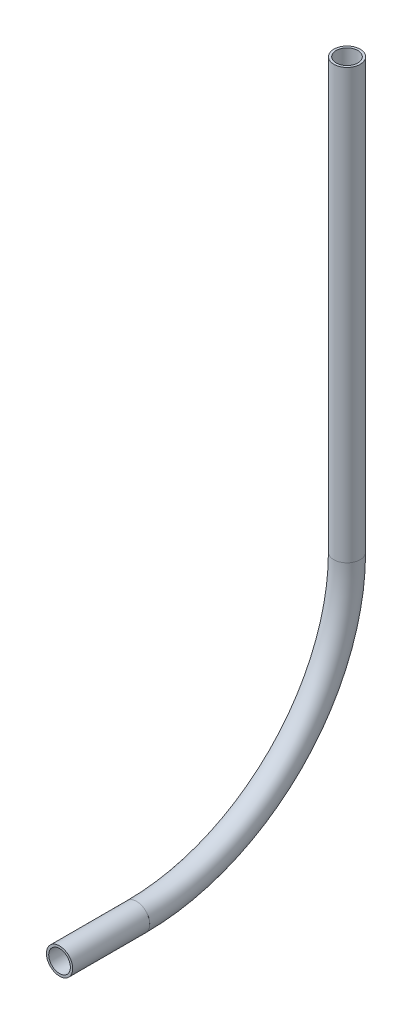
ISO-10303-21;
HEADER;
FILE_DESCRIPTION(('STEP AP214'),'2;1');
FILE_NAME('part.step','',(''),(''),'','','');
FILE_SCHEMA(('AUTOMOTIVE_DESIGN { 1 0 10303 214 1 1 1 1 }'));
ENDSEC;
DATA;
#1=APPLICATION_CONTEXT('core data for automotive mechanical design processes');
#2=APPLICATION_PROTOCOL_DEFINITION('international standard','automotive_design',2000,#1);
#3=PRODUCT_CONTEXT('',#1,'mechanical');
#4=PRODUCT('Part','Part','',(#3));
#5=PRODUCT_RELATED_PRODUCT_CATEGORY('part','',(#4));
#6=PRODUCT_DEFINITION_FORMATION('','',#4);
#7=PRODUCT_DEFINITION_CONTEXT('part definition',#1,'design');
#8=PRODUCT_DEFINITION('design','',#6,#7);
#9=PRODUCT_DEFINITION_SHAPE('','',#8);
#10=(LENGTH_UNIT() NAMED_UNIT(*) SI_UNIT(.MILLI.,.METRE.));
#11=(NAMED_UNIT(*) PLANE_ANGLE_UNIT() SI_UNIT($,.RADIAN.));
#12=(NAMED_UNIT(*) SI_UNIT($,.STERADIAN.) SOLID_ANGLE_UNIT());
#13=UNCERTAINTY_MEASURE_WITH_UNIT(LENGTH_MEASURE(1.E-05),#10,'distance_accuracy_value','');
#14=(GEOMETRIC_REPRESENTATION_CONTEXT(3) GLOBAL_UNCERTAINTY_ASSIGNED_CONTEXT((#13)) GLOBAL_UNIT_ASSIGNED_CONTEXT((#10,
#11,#12)) REPRESENTATION_CONTEXT('',''));
#15=CARTESIAN_POINT('',(0.,0.,0.));
#16=DIRECTION('',(0.,0.,1.));
#17=DIRECTION('',(1.,0.,0.));
#18=AXIS2_PLACEMENT_3D('',#15,#16,#17);
#19=CARTESIAN_POINT('',(0.,598.064549316462,284.557390711818));
#20=DIRECTION('',(0.,0.,1.));
#21=DIRECTION('',(1.,0.,0.));
#22=AXIS2_PLACEMENT_3D('',#19,#20,#21);
#23=CYLINDRICAL_SURFACE('',#22,2.61620000000002);
#24=CARTESIAN_POINT('',(0.,598.064549316462,303.16459571102));
#25=DIRECTION('',(0.,0.,-1.));
#26=DIRECTION('',(-1.,0.,0.));
#27=AXIS2_PLACEMENT_3D('',#24,#25,#26);
#28=CIRCLE('',#27,2.61620000000002);
#29=CARTESIAN_POINT('',(-2.61620000000002,598.064549316462,303.16459571102));
#30=VERTEX_POINT('',#29);
#31=EDGE_CURVE('E55',#30,#30,#28,.T.);
#32=ORIENTED_EDGE('',*,*,#31,.F.);
#33=EDGE_LOOP('',(#32));
#34=FACE_BOUND('',#33,.T.);
#35=CARTESIAN_POINT('',(0.,598.064549316462,284.557390711818));
#36=DIRECTION('',(0.,0.,-1.));
#37=DIRECTION('',(-1.,0.,0.));
#38=AXIS2_PLACEMENT_3D('',#35,#36,#37);
#39=CIRCLE('',#38,2.61620000000002);
#40=CARTESIAN_POINT('',(-2.61620000000002,598.064549316462,284.557390711818));
#41=VERTEX_POINT('',#40);
#42=EDGE_CURVE('E51',#41,#41,#39,.T.);
#43=ORIENTED_EDGE('',*,*,#42,.T.);
#44=EDGE_LOOP('',(#43));
#45=FACE_BOUND('',#44,.T.);
#46=ADVANCED_FACE('F47',(#34,#45),#23,.F.);
#47=CARTESIAN_POINT('',(0.,598.064549316462,284.557390711818));
#48=DIRECTION('',(0.,0.,1.));
#49=DIRECTION('',(1.,0.,0.));
#50=AXIS2_PLACEMENT_3D('',#47,#48,#49);
#51=CYLINDRICAL_SURFACE('',#50,3.17499999999997);
#52=CARTESIAN_POINT('',(0.,598.064549316462,303.16459571102));
#53=DIRECTION('',(0.,0.,-1.));
#54=DIRECTION('',(-1.,0.,0.));
#55=AXIS2_PLACEMENT_3D('',#52,#53,#54);
#56=CIRCLE('',#55,3.17499999999997);
#57=CARTESIAN_POINT('',(-3.17499999999997,598.064549316462,303.16459571102));
#58=VERTEX_POINT('',#57);
#59=EDGE_CURVE('E59',#58,#58,#56,.T.);
#60=ORIENTED_EDGE('',*,*,#59,.T.);
#61=EDGE_LOOP('',(#60));
#62=FACE_BOUND('',#61,.T.);
#63=CARTESIAN_POINT('',(0.,598.064549316462,284.557390711818));
#64=DIRECTION('',(0.,0.,-1.));
#65=DIRECTION('',(-1.,0.,0.));
#66=AXIS2_PLACEMENT_3D('',#63,#64,#65);
#67=CIRCLE('',#66,3.17499999999997);
#68=CARTESIAN_POINT('',(-3.17499999999997,598.064549316462,284.557390711818));
#69=VERTEX_POINT('',#68);
#70=EDGE_CURVE('E12',#69,#69,#67,.T.);
#71=ORIENTED_EDGE('',*,*,#70,.F.);
#72=EDGE_LOOP('',(#71));
#73=FACE_BOUND('',#72,.T.);
#74=ADVANCED_FACE('F74',(#62,#73),#51,.T.);
#75=CARTESIAN_POINT('',(0.,598.064549316462,303.16459571102));
#76=DIRECTION('',(0.,0.,-1.));
#77=DIRECTION('',(-1.,0.,0.));
#78=AXIS2_PLACEMENT_3D('',#75,#76,#77);
#79=PLANE('',#78);
#80=ORIENTED_EDGE('',*,*,#31,.T.);
#81=EDGE_LOOP('',(#80));
#82=FACE_BOUND('',#81,.T.);
#83=ORIENTED_EDGE('',*,*,#59,.F.);
#84=EDGE_LOOP('',(#83));
#85=FACE_BOUND('',#84,.T.);
#86=ADVANCED_FACE('F70',(#82,#85),#79,.F.);
#87=CARTESIAN_POINT('',(0.,598.064549316462,284.557390711818));
#88=DIRECTION('',(0.,0.,-1.));
#89=DIRECTION('',(-1.,0.,0.));
#90=AXIS2_PLACEMENT_3D('',#87,#88,#89);
#91=PLANE('',#90);
#92=ORIENTED_EDGE('',*,*,#42,.F.);
#93=EDGE_LOOP('',(#92));
#94=FACE_BOUND('',#93,.T.);
#95=ORIENTED_EDGE('',*,*,#70,.T.);
#96=EDGE_LOOP('',(#95));
#97=FACE_BOUND('',#96,.T.);
#98=ADVANCED_FACE('F49',(#94,#97),#91,.T.);
#99=CLOSED_SHELL('',(#46,#74,#86,#98));
#100=MANIFOLD_SOLID_BREP('B2',#99);
#101=CARTESIAN_POINT('',(0.,648.864549316462,284.557390711818));
#102=DIRECTION('',(-1.,0.,0.));
#103=DIRECTION('',(0.,0.,1.));
#104=AXIS2_PLACEMENT_3D('',#101,#102,#103);
#105=TOROIDAL_SURFACE('',#104,50.8,2.61620000000002);
#106=CARTESIAN_POINT('',(0.,648.864549316462,233.757390711818));
#107=DIRECTION('',(0.,1.,0.));
#108=DIRECTION('',(0.,0.,1.));
#109=AXIS2_PLACEMENT_3D('',#106,#107,#108);
#110=CIRCLE('',#109,2.61620000000002);
#111=CARTESIAN_POINT('',(0.,648.864549316462,231.141190711818));
#112=VERTEX_POINT('',#111);
#113=EDGE_CURVE('E150',#112,#112,#110,.T.);
#114=CARTESIAN_POINT('',(0.,598.064549316462,284.557390711818));
#115=DIRECTION('',(0.,0.,1.));
#116=DIRECTION('',(1.,0.,0.));
#117=AXIS2_PLACEMENT_3D('',#114,#115,#116);
#118=CIRCLE('',#117,2.61620000000002);
#119=CARTESIAN_POINT('',(0.,595.448349316462,284.557390711818));
#120=VERTEX_POINT('',#119);
#121=EDGE_CURVE('E140',#120,#120,#118,.T.);
#122=CARTESIAN_POINT('',(0.,648.864549316462,284.557390711818));
#123=DIRECTION('',(-1.,0.,0.));
#124=DIRECTION('',(0.,0.,1.));
#125=AXIS2_PLACEMENT_3D('',#122,#123,#124);
#126=CIRCLE('',#125,53.4162);
#127=EDGE_CURVE('',#112,#120,#126,.T.);
#128=ORIENTED_EDGE('',*,*,#113,.T.);
#129=ORIENTED_EDGE('',*,*,#121,.T.);
#130=ORIENTED_EDGE('',*,*,#127,.T.);
#131=ORIENTED_EDGE('',*,*,#127,.F.);
#132=EDGE_LOOP('',(#128,#130,#129,#131));
#133=FACE_BOUND('',#132,.T.);
#134=ADVANCED_FACE('F136',(#133),#105,.F.);
#135=CARTESIAN_POINT('',(0.,648.864549316462,284.557390711818));
#136=DIRECTION('',(-1.,0.,0.));
#137=DIRECTION('',(0.,0.,1.));
#138=AXIS2_PLACEMENT_3D('',#135,#136,#137);
#139=TOROIDAL_SURFACE('',#138,50.8,3.17499999999997);
#140=CARTESIAN_POINT('',(0.,648.864549316462,233.757390711818));
#141=DIRECTION('',(0.,1.,0.));
#142=DIRECTION('',(0.,0.,1.));
#143=AXIS2_PLACEMENT_3D('',#140,#141,#142);
#144=CIRCLE('',#143,3.17499999999997);
#145=CARTESIAN_POINT('',(0.,648.864549316462,230.582390711818));
#146=VERTEX_POINT('',#145);
#147=EDGE_CURVE('E144',#146,#146,#144,.T.);
#148=CARTESIAN_POINT('',(0.,598.064549316462,284.557390711818));
#149=DIRECTION('',(0.,0.,1.));
#150=DIRECTION('',(1.,0.,0.));
#151=AXIS2_PLACEMENT_3D('',#148,#149,#150);
#152=CIRCLE('',#151,3.17499999999997);
#153=CARTESIAN_POINT('',(0.,594.889549316462,284.557390711818));
#154=VERTEX_POINT('',#153);
#155=EDGE_CURVE('E46',#154,#154,#152,.T.);
#156=CARTESIAN_POINT('',(0.,648.864549316462,284.557390711818));
#157=DIRECTION('',(-1.,0.,0.));
#158=DIRECTION('',(0.,0.,1.));
#159=AXIS2_PLACEMENT_3D('',#156,#157,#158);
#160=CIRCLE('',#159,53.975);
#161=EDGE_CURVE('',#146,#154,#160,.T.);
#162=ORIENTED_EDGE('',*,*,#147,.F.);
#163=ORIENTED_EDGE('',*,*,#155,.F.);
#164=ORIENTED_EDGE('',*,*,#161,.T.);
#165=ORIENTED_EDGE('',*,*,#161,.F.);
#166=EDGE_LOOP('',(#162,#164,#163,#165));
#167=FACE_BOUND('',#166,.T.);
#168=ADVANCED_FACE('F163',(#167),#139,.T.);
#169=CARTESIAN_POINT('',(0.,648.864549316462,233.757390711818));
#170=DIRECTION('',(0.,1.,0.));
#171=DIRECTION('',(0.,0.,1.));
#172=AXIS2_PLACEMENT_3D('',#169,#170,#171);
#173=PLANE('',#172);
#174=ORIENTED_EDGE('',*,*,#113,.F.);
#175=EDGE_LOOP('',(#174));
#176=FACE_BOUND('',#175,.T.);
#177=ORIENTED_EDGE('',*,*,#147,.T.);
#178=EDGE_LOOP('',(#177));
#179=FACE_BOUND('',#178,.T.);
#180=ADVANCED_FACE('F159',(#176,#179),#173,.T.);
#181=CARTESIAN_POINT('',(0.,598.064549316462,284.557390711818));
#182=DIRECTION('',(0.,0.,1.));
#183=DIRECTION('',(1.,0.,0.));
#184=AXIS2_PLACEMENT_3D('',#181,#182,#183);
#185=PLANE('',#184);
#186=ORIENTED_EDGE('',*,*,#121,.F.);
#187=EDGE_LOOP('',(#186));
#188=FACE_BOUND('',#187,.T.);
#189=ORIENTED_EDGE('',*,*,#155,.T.);
#190=EDGE_LOOP('',(#189));
#191=FACE_BOUND('',#190,.T.);
#192=ADVANCED_FACE('F138',(#188,#191),#185,.T.);
#193=CLOSED_SHELL('',(#134,#168,#180,#192));
#194=MANIFOLD_SOLID_BREP('B7',#193);
#195=CARTESIAN_POINT('',(0.,752.458618261262,233.757390711818));
#196=DIRECTION('',(0.,-1.,0.));
#197=DIRECTION('',(0.,0.,-1.));
#198=AXIS2_PLACEMENT_3D('',#195,#196,#197);
#199=CYLINDRICAL_SURFACE('',#198,2.61620000000002);
#200=CARTESIAN_POINT('',(0.,752.458618261262,233.757390711818));
#201=DIRECTION('',(0.,1.,0.));
#202=DIRECTION('',(-1.,0.,0.));
#203=AXIS2_PLACEMENT_3D('',#200,#201,#202);
#204=CIRCLE('',#203,2.61620000000002);
#205=CARTESIAN_POINT('',(-2.61620000000002,752.458618261262,233.757390711818));
#206=VERTEX_POINT('',#205);
#207=EDGE_CURVE('E234',#206,#206,#204,.T.);
#208=ORIENTED_EDGE('',*,*,#207,.T.);
#209=EDGE_LOOP('',(#208));
#210=FACE_BOUND('',#209,.T.);
#211=CARTESIAN_POINT('',(0.,648.864549316462,233.757390711818));
#212=DIRECTION('',(0.,-1.,0.));
#213=DIRECTION('',(0.,0.,-1.));
#214=AXIS2_PLACEMENT_3D('',#211,#212,#213);
#215=CIRCLE('',#214,2.61620000000002);
#216=CARTESIAN_POINT('',(0.,648.864549316462,231.141190711818));
#217=VERTEX_POINT('',#216);
#218=EDGE_CURVE('E224',#217,#217,#215,.T.);
#219=ORIENTED_EDGE('',*,*,#218,.T.);
#220=EDGE_LOOP('',(#219));
#221=FACE_BOUND('',#220,.T.);
#222=ADVANCED_FACE('F220',(#210,#221),#199,.F.);
#223=CARTESIAN_POINT('',(0.,752.458618261262,233.757390711818));
#224=DIRECTION('',(0.,-1.,0.));
#225=DIRECTION('',(0.,0.,-1.));
#226=AXIS2_PLACEMENT_3D('',#223,#224,#225);
#227=CYLINDRICAL_SURFACE('',#226,3.17499999999997);
#228=CARTESIAN_POINT('',(0.,752.458618261262,233.757390711818));
#229=DIRECTION('',(0.,1.,0.));
#230=DIRECTION('',(-1.,0.,0.));
#231=AXIS2_PLACEMENT_3D('',#228,#229,#230);
#232=CIRCLE('',#231,3.17499999999997);
#233=CARTESIAN_POINT('',(-3.17499999999997,752.458618261262,233.757390711818));
#234=VERTEX_POINT('',#233);
#235=EDGE_CURVE('E228',#234,#234,#232,.T.);
#236=ORIENTED_EDGE('',*,*,#235,.F.);
#237=EDGE_LOOP('',(#236));
#238=FACE_BOUND('',#237,.T.);
#239=CARTESIAN_POINT('',(0.,648.864549316462,233.757390711818));
#240=DIRECTION('',(0.,-1.,0.));
#241=DIRECTION('',(0.,0.,-1.));
#242=AXIS2_PLACEMENT_3D('',#239,#240,#241);
#243=CIRCLE('',#242,3.17499999999997);
#244=CARTESIAN_POINT('',(0.,648.864549316462,230.582390711818));
#245=VERTEX_POINT('',#244);
#246=EDGE_CURVE('E135',#245,#245,#243,.T.);
#247=ORIENTED_EDGE('',*,*,#246,.F.);
#248=EDGE_LOOP('',(#247));
#249=FACE_BOUND('',#248,.T.);
#250=ADVANCED_FACE('F247',(#238,#249),#227,.T.);
#251=CARTESIAN_POINT('',(0.,752.458618261262,233.757390711818));
#252=DIRECTION('',(0.,1.,0.));
#253=DIRECTION('',(-1.,0.,0.));
#254=AXIS2_PLACEMENT_3D('',#251,#252,#253);
#255=PLANE('',#254);
#256=ORIENTED_EDGE('',*,*,#207,.F.);
#257=EDGE_LOOP('',(#256));
#258=FACE_BOUND('',#257,.T.);
#259=ORIENTED_EDGE('',*,*,#235,.T.);
#260=EDGE_LOOP('',(#259));
#261=FACE_BOUND('',#260,.T.);
#262=ADVANCED_FACE('F243',(#258,#261),#255,.T.);
#263=CARTESIAN_POINT('',(0.,648.864549316462,233.757390711818));
#264=DIRECTION('',(0.,-1.,0.));
#265=DIRECTION('',(0.,0.,-1.));
#266=AXIS2_PLACEMENT_3D('',#263,#264,#265);
#267=PLANE('',#266);
#268=ORIENTED_EDGE('',*,*,#218,.F.);
#269=EDGE_LOOP('',(#268));
#270=FACE_BOUND('',#269,.T.);
#271=ORIENTED_EDGE('',*,*,#246,.T.);
#272=EDGE_LOOP('',(#271));
#273=FACE_BOUND('',#272,.T.);
#274=ADVANCED_FACE('F222',(#270,#273),#267,.T.);
#275=CLOSED_SHELL('',(#222,#250,#262,#274));
#276=MANIFOLD_SOLID_BREP('B41',#275);
#277=ADVANCED_BREP_SHAPE_REPRESENTATION('',(#18,#100,#194,#276),#14);
#278=SHAPE_DEFINITION_REPRESENTATION(#9,#277);
ENDSEC;
END-ISO-10303-21;
